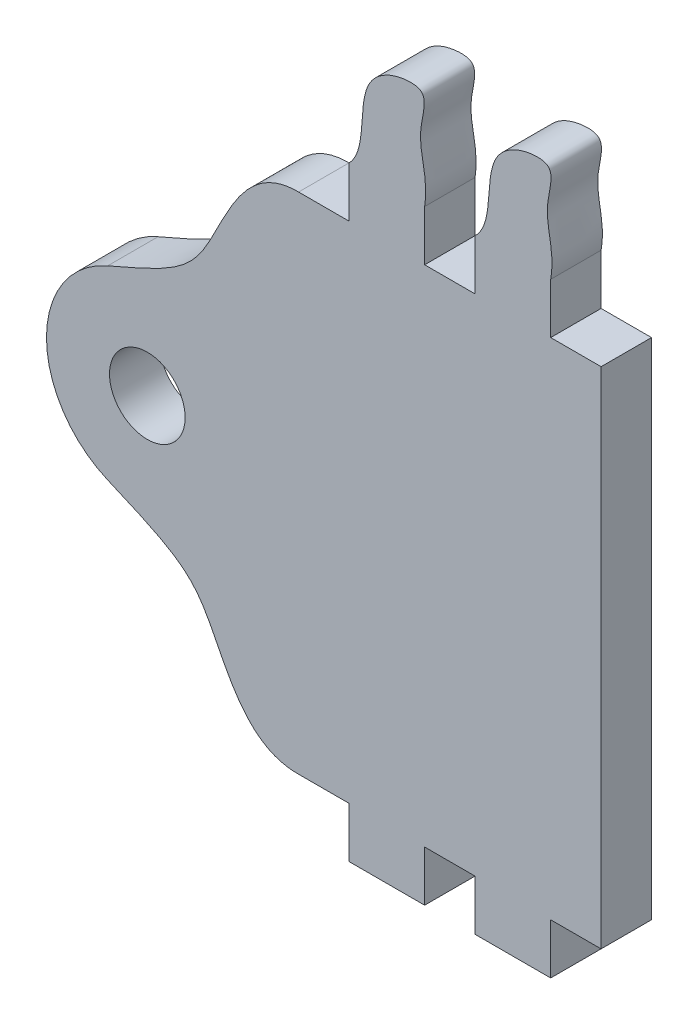
ISO-10303-21;
HEADER;
FILE_DESCRIPTION(('STEP AP214'),'2;1');
FILE_NAME('part.step','',(''),(''),'','','');
FILE_SCHEMA(('AUTOMOTIVE_DESIGN { 1 0 10303 214 1 1 1 1 }'));
ENDSEC;
DATA;
#1=APPLICATION_CONTEXT('core data for automotive mechanical design processes');
#2=APPLICATION_PROTOCOL_DEFINITION('international standard','automotive_design',2000,#1);
#3=PRODUCT_CONTEXT('',#1,'mechanical');
#4=PRODUCT('Part','Part','',(#3));
#5=PRODUCT_RELATED_PRODUCT_CATEGORY('part','',(#4));
#6=PRODUCT_DEFINITION_FORMATION('','',#4);
#7=PRODUCT_DEFINITION_CONTEXT('part definition',#1,'design');
#8=PRODUCT_DEFINITION('design','',#6,#7);
#9=PRODUCT_DEFINITION_SHAPE('','',#8);
#10=(LENGTH_UNIT() NAMED_UNIT(*) SI_UNIT(.MILLI.,.METRE.));
#11=(NAMED_UNIT(*) PLANE_ANGLE_UNIT() SI_UNIT($,.RADIAN.));
#12=(NAMED_UNIT(*) SI_UNIT($,.STERADIAN.) SOLID_ANGLE_UNIT());
#13=UNCERTAINTY_MEASURE_WITH_UNIT(LENGTH_MEASURE(1.E-05),#10,'distance_accuracy_value','');
#14=(GEOMETRIC_REPRESENTATION_CONTEXT(3) GLOBAL_UNCERTAINTY_ASSIGNED_CONTEXT((#13)) GLOBAL_UNIT_ASSIGNED_CONTEXT((#10,
#11,#12)) REPRESENTATION_CONTEXT('',''));
#15=CARTESIAN_POINT('',(0.,0.,0.));
#16=DIRECTION('',(0.,0.,1.));
#17=DIRECTION('',(1.,0.,0.));
#18=AXIS2_PLACEMENT_3D('',#15,#16,#17);
#19=CARTESIAN_POINT('',(1.5875,19.05,3.175));
#20=CARTESIAN_POINT('',(2.87606069652057,20.2829772560216,3.175));
#21=CARTESIAN_POINT('',(1.75087616831117,23.7170103339782,3.175));
#22=CARTESIAN_POINT('',(4.48010535425709,25.3439433085735,3.175));
#23=CARTESIAN_POINT('',(6.71396979884259,25.323271855298,3.175));
#24=CARTESIAN_POINT('',(5.66462971551239,22.0755663258377,3.175));
#25=CARTESIAN_POINT('',(6.66156491028358,20.8587639296577,3.175));
#26=CARTESIAN_POINT('',(6.35,19.05,3.175));
#27=B_SPLINE_CURVE_WITH_KNOTS('',3,(#19,#20,#21,#22,#23,#24,#25,#26),.UNSPECIFIED.,.F.,.F.,(4,1,
1,1,1,4),(0.,0.347503901702422,0.512635707363676,0.589513020634841,0.71223246177755,1.),.UNSPECIFIED.);
#28=DIRECTION('',(0.,0.,-1.));
#29=VECTOR('',#28,1.);
#30=SURFACE_OF_LINEAR_EXTRUSION('',#27,#29);
#31=CARTESIAN_POINT('',(1.5875,19.05,0.));
#32=CARTESIAN_POINT('',(2.87606069652057,20.2829772560216,0.));
#33=CARTESIAN_POINT('',(1.75087616831117,23.7170103339782,0.));
#34=CARTESIAN_POINT('',(4.48010535425709,25.3439433085735,0.));
#35=CARTESIAN_POINT('',(6.71396979884259,25.323271855298,0.));
#36=CARTESIAN_POINT('',(5.66462971551239,22.0755663258377,0.));
#37=CARTESIAN_POINT('',(6.66156491028358,20.8587639296577,0.));
#38=CARTESIAN_POINT('',(6.35,19.05,0.));
#39=B_SPLINE_CURVE_WITH_KNOTS('',3,(#31,#32,#33,#34,#35,#36,#37,#38),.UNSPECIFIED.,.F.,.F.,(4,1,
1,1,1,4),(0.,0.347503901702422,0.512635707363676,0.589513020634841,0.71223246177755,1.),.UNSPECIFIED.);
#40=CARTESIAN_POINT('',(1.5875,19.05,0.));
#41=VERTEX_POINT('',#40);
#42=CARTESIAN_POINT('',(6.35,19.05,0.));
#43=VERTEX_POINT('',#42);
#44=EDGE_CURVE('E355',#41,#43,#39,.T.);
#45=ORIENTED_EDGE('',*,*,#44,.F.);
#46=DIRECTION('',(0.,0.,-1.));
#47=VECTOR('',#46,1.);
#48=CARTESIAN_POINT('',(1.5875,19.05,3.175));
#49=LINE('',#48,#47);
#50=CARTESIAN_POINT('',(1.5875,19.05,3.175));
#51=VERTEX_POINT('',#50);
#52=EDGE_CURVE('E12',#51,#41,#49,.T.);
#53=ORIENTED_EDGE('',*,*,#52,.F.);
#54=CARTESIAN_POINT('',(6.35,19.05,3.175));
#55=VERTEX_POINT('',#54);
#56=EDGE_CURVE('E363',#51,#55,#27,.T.);
#57=ORIENTED_EDGE('',*,*,#56,.T.);
#58=DIRECTION('',(0.,0.,-1.));
#59=VECTOR('',#58,1.);
#60=CARTESIAN_POINT('',(6.35,19.05,3.175));
#61=LINE('',#60,#59);
#62=EDGE_CURVE('E206',#55,#43,#61,.T.);
#63=ORIENTED_EDGE('',*,*,#62,.T.);
#64=EDGE_LOOP('',(#45,#53,#57,#63));
#65=FACE_BOUND('',#64,.T.);
#66=ADVANCED_FACE('F196',(#65),#30,.T.);
#67=CARTESIAN_POINT('',(0.,0.,3.175));
#68=DIRECTION('',(0.,0.,1.));
#69=DIRECTION('',(1.,0.,0.));
#70=AXIS2_PLACEMENT_3D('',#67,#68,#69);
#71=PLANE('',#70);
#72=ORIENTED_EDGE('',*,*,#56,.F.);
#73=DIRECTION('',(0.,1.,0.));
#74=VECTOR('',#73,1.);
#75=CARTESIAN_POINT('',(1.5875,15.875,3.175));
#76=LINE('',#75,#74);
#77=CARTESIAN_POINT('',(1.5875,15.875,3.175));
#78=VERTEX_POINT('',#77);
#79=EDGE_CURVE('E349',#78,#51,#76,.T.);
#80=ORIENTED_EDGE('',*,*,#79,.F.);
#81=DIRECTION('',(-1.,0.,0.));
#82=VECTOR('',#81,1.);
#83=CARTESIAN_POINT('',(0.,15.875,3.175));
#84=LINE('',#83,#82);
#85=CARTESIAN_POINT('',(-1.5875,15.875,3.175));
#86=VERTEX_POINT('',#85);
#87=EDGE_CURVE('E360',#78,#86,#84,.T.);
#88=ORIENTED_EDGE('',*,*,#87,.T.);
#89=DIRECTION('',(0.,1.,0.));
#90=VECTOR('',#89,1.);
#91=CARTESIAN_POINT('',(-1.5875,0.,3.175));
#92=LINE('',#91,#90);
#93=CARTESIAN_POINT('',(-1.5875,19.05,3.175));
#94=VERTEX_POINT('',#93);
#95=EDGE_CURVE('E376',#86,#94,#92,.T.);
#96=ORIENTED_EDGE('',*,*,#95,.T.);
#97=CARTESIAN_POINT('',(-6.35,19.05,3.175));
#98=CARTESIAN_POINT('',(-5.10894803273728,20.3128381420379,3.175));
#99=CARTESIAN_POINT('',(-6.2487975668104,23.7826275370671,3.175));
#100=CARTESIAN_POINT('',(-3.50466824511369,25.4227491748254,3.175));
#101=CARTESIAN_POINT('',(-1.27059543399362,25.4018504855543,3.175));
#102=CARTESIAN_POINT('',(-2.33046195009797,22.1181936868102,3.175));
#103=CARTESIAN_POINT('',(-1.30296019047837,20.9022932957206,3.175));
#104=CARTESIAN_POINT('',(-1.5875,19.05,3.175));
#105=B_SPLINE_CURVE_WITH_KNOTS('',3,(#97,#98,#99,#100,#101,#102,#103,#104),.UNSPECIFIED.,.F.,
.F.,(4,1,1,1,1,4),(0.,0.348300856335532,0.511853830627675,0.58799611703179,0.709542233008579,
1.),.UNSPECIFIED.);
#106=CARTESIAN_POINT('',(-6.35,19.05,3.175));
#107=VERTEX_POINT('',#106);
#108=EDGE_CURVE('E484',#107,#94,#105,.T.);
#109=ORIENTED_EDGE('',*,*,#108,.F.);
#110=DIRECTION('',(0.,1.,0.));
#111=VECTOR('',#110,1.);
#112=CARTESIAN_POINT('',(-6.35,0.,3.175));
#113=LINE('',#112,#111);
#114=CARTESIAN_POINT('',(-6.35,15.875,3.175));
#115=VERTEX_POINT('',#114);
#116=EDGE_CURVE('E491',#115,#107,#113,.T.);
#117=ORIENTED_EDGE('',*,*,#116,.F.);
#118=CARTESIAN_POINT('',(-9.525,15.875,3.175));
#119=VERTEX_POINT('',#118);
#120=EDGE_CURVE('E374',#115,#119,#84,.T.);
#121=ORIENTED_EDGE('',*,*,#120,.T.);
#122=CARTESIAN_POINT('',(-21.5475943035882,5.83819515729678,3.175));
#123=CARTESIAN_POINT('',(-17.7413983110654,7.46649520091281,3.175));
#124=CARTESIAN_POINT('',(-15.0309393036737,8.83650062794347,3.175));
#125=CARTESIAN_POINT('',(-13.0092812161382,15.9170915840705,3.175));
#126=CARTESIAN_POINT('',(-9.525,15.875,3.175));
#127=B_SPLINE_CURVE_WITH_KNOTS('',3,(#122,#123,#124,#125,#126),.UNSPECIFIED.,.F.,.F.,(4,1,4),
(0.,0.458191309021658,1.),.UNSPECIFIED.);
#128=CARTESIAN_POINT('',(-21.5475943035882,5.83819515729678,3.175));
#129=VERTEX_POINT('',#128);
#130=EDGE_CURVE('E380',#129,#119,#127,.T.);
#131=ORIENTED_EDGE('',*,*,#130,.F.);
#132=CARTESIAN_POINT('',(-19.05,0.,3.175));
#133=DIRECTION('',(0.,0.,1.));
#134=DIRECTION('',(1.,0.,0.));
#135=AXIS2_PLACEMENT_3D('',#132,#133,#134);
#136=CIRCLE('',#135,6.35);
#137=CARTESIAN_POINT('',(-21.5475943035882,-5.83819515729678,3.175));
#138=VERTEX_POINT('',#137);
#139=EDGE_CURVE('E387',#129,#138,#136,.T.);
#140=ORIENTED_EDGE('',*,*,#139,.T.);
#141=CARTESIAN_POINT('',(-21.5475943035882,-5.83819515729679,3.175));
#142=CARTESIAN_POINT('',(-17.7413983110654,-7.46649520091282,3.175));
#143=CARTESIAN_POINT('',(-15.0309393036737,-8.83650062794347,3.175));
#144=CARTESIAN_POINT('',(-13.0092812161382,-15.9170915840705,3.175));
#145=CARTESIAN_POINT('',(-9.525,-15.875,3.175));
#146=B_SPLINE_CURVE_WITH_KNOTS('',3,(#141,#142,#143,#144,#145),.UNSPECIFIED.,.F.,.F.,(4,1,4),
(0.,0.458191309021658,1.),.UNSPECIFIED.);
#147=CARTESIAN_POINT('',(-9.525,-15.875,3.175));
#148=VERTEX_POINT('',#147);
#149=EDGE_CURVE('E564',#138,#148,#146,.T.);
#150=ORIENTED_EDGE('',*,*,#149,.T.);
#151=DIRECTION('',(-1.,0.,0.));
#152=VECTOR('',#151,1.);
#153=CARTESIAN_POINT('',(0.,-15.875,3.175));
#154=LINE('',#153,#152);
#155=CARTESIAN_POINT('',(-6.34999999999999,-15.875,3.175));
#156=VERTEX_POINT('',#155);
#157=EDGE_CURVE('E574',#156,#148,#154,.T.);
#158=ORIENTED_EDGE('',*,*,#157,.F.);
#159=DIRECTION('',(0.,-1.,0.));
#160=VECTOR('',#159,1.);
#161=CARTESIAN_POINT('',(-6.35,0.,3.175));
#162=LINE('',#161,#160);
#163=CARTESIAN_POINT('',(-6.34999999999999,-19.05,3.175));
#164=VERTEX_POINT('',#163);
#165=EDGE_CURVE('E576',#156,#164,#162,.T.);
#166=ORIENTED_EDGE('',*,*,#165,.T.);
#167=DIRECTION('',(1.,0.,0.));
#168=VECTOR('',#167,1.);
#169=CARTESIAN_POINT('',(0.,-19.05,3.175));
#170=LINE('',#169,#168);
#171=CARTESIAN_POINT('',(-1.58749999999999,-19.05,3.175));
#172=VERTEX_POINT('',#171);
#173=EDGE_CURVE('E820',#164,#172,#170,.T.);
#174=ORIENTED_EDGE('',*,*,#173,.T.);
#175=DIRECTION('',(0.,-1.,0.));
#176=VECTOR('',#175,1.);
#177=CARTESIAN_POINT('',(-1.5875,0.,3.175));
#178=LINE('',#177,#176);
#179=CARTESIAN_POINT('',(-1.58749999999999,-15.875,3.175));
#180=VERTEX_POINT('',#179);
#181=EDGE_CURVE('E823',#180,#172,#178,.T.);
#182=ORIENTED_EDGE('',*,*,#181,.F.);
#183=CARTESIAN_POINT('',(1.58750000000001,-15.875,3.175));
#184=VERTEX_POINT('',#183);
#185=EDGE_CURVE('E578',#184,#180,#154,.T.);
#186=ORIENTED_EDGE('',*,*,#185,.F.);
#187=DIRECTION('',(0.,-1.,0.));
#188=VECTOR('',#187,1.);
#189=CARTESIAN_POINT('',(1.5875,0.,3.175));
#190=LINE('',#189,#188);
#191=CARTESIAN_POINT('',(1.58750000000001,-19.05,3.175));
#192=VERTEX_POINT('',#191);
#193=EDGE_CURVE('E827',#184,#192,#190,.T.);
#194=ORIENTED_EDGE('',*,*,#193,.T.);
#195=DIRECTION('',(1.,0.,0.));
#196=VECTOR('',#195,1.);
#197=CARTESIAN_POINT('',(0.,-19.05,3.175));
#198=LINE('',#197,#196);
#199=CARTESIAN_POINT('',(6.35000000000001,-19.05,3.175));
#200=VERTEX_POINT('',#199);
#201=EDGE_CURVE('E829',#192,#200,#198,.T.);
#202=ORIENTED_EDGE('',*,*,#201,.T.);
#203=DIRECTION('',(0.,-1.,0.));
#204=VECTOR('',#203,1.);
#205=CARTESIAN_POINT('',(6.35,0.,3.175));
#206=LINE('',#205,#204);
#207=CARTESIAN_POINT('',(6.35000000000001,-15.875,3.175));
#208=VERTEX_POINT('',#207);
#209=EDGE_CURVE('E831',#208,#200,#206,.T.);
#210=ORIENTED_EDGE('',*,*,#209,.F.);
#211=CARTESIAN_POINT('',(9.525,-15.875,3.175));
#212=VERTEX_POINT('',#211);
#213=EDGE_CURVE('E377',#212,#208,#154,.T.);
#214=ORIENTED_EDGE('',*,*,#213,.F.);
#215=DIRECTION('',(0.,1.,0.));
#216=VECTOR('',#215,1.);
#217=CARTESIAN_POINT('',(9.525,0.,3.175));
#218=LINE('',#217,#216);
#219=CARTESIAN_POINT('',(9.525,15.875,3.175));
#220=VERTEX_POINT('',#219);
#221=EDGE_CURVE('E372',#212,#220,#218,.T.);
#222=ORIENTED_EDGE('',*,*,#221,.T.);
#223=CARTESIAN_POINT('',(6.35,15.875,3.175));
#224=VERTEX_POINT('',#223);
#225=EDGE_CURVE('E371',#220,#224,#84,.T.);
#226=ORIENTED_EDGE('',*,*,#225,.T.);
#227=DIRECTION('',(0.,1.,0.));
#228=VECTOR('',#227,1.);
#229=CARTESIAN_POINT('',(6.35,15.875,3.175));
#230=LINE('',#229,#228);
#231=EDGE_CURVE('E365',#224,#55,#230,.T.);
#232=ORIENTED_EDGE('',*,*,#231,.T.);
#233=EDGE_LOOP('',(#72,#80,#88,#96,#109,#117,#121,#131,#140,#150,#158,#166,#174,#182,#186,#194,
#202,#210,#214,#222,#226,#232));
#234=FACE_BOUND('',#233,.T.);
#235=CARTESIAN_POINT('',(-19.05,0.,3.175));
#236=DIRECTION('',(0.,0.,1.));
#237=DIRECTION('',(1.,0.,0.));
#238=AXIS2_PLACEMENT_3D('',#235,#236,#237);
#239=CIRCLE('',#238,2.38125);
#240=CARTESIAN_POINT('',(-16.66875,0.,3.175));
#241=VERTEX_POINT('',#240);
#242=EDGE_CURVE('E401',#241,#241,#239,.T.);
#243=ORIENTED_EDGE('',*,*,#242,.F.);
#244=EDGE_LOOP('',(#243));
#245=FACE_BOUND('',#244,.T.);
#246=ADVANCED_FACE('F358',(#234,#245),#71,.T.);
#247=CARTESIAN_POINT('',(0.,0.,0.));
#248=DIRECTION('',(0.,0.,1.));
#249=DIRECTION('',(1.,0.,0.));
#250=AXIS2_PLACEMENT_3D('',#247,#248,#249);
#251=PLANE('',#250);
#252=ORIENTED_EDGE('',*,*,#44,.T.);
#253=DIRECTION('',(0.,1.,0.));
#254=VECTOR('',#253,1.);
#255=CARTESIAN_POINT('',(6.35,15.875,0.));
#256=LINE('',#255,#254);
#257=CARTESIAN_POINT('',(6.35,15.875,0.));
#258=VERTEX_POINT('',#257);
#259=EDGE_CURVE('E439',#258,#43,#256,.T.);
#260=ORIENTED_EDGE('',*,*,#259,.F.);
#261=DIRECTION('',(-1.,0.,0.));
#262=VECTOR('',#261,1.);
#263=CARTESIAN_POINT('',(0.,15.875,0.));
#264=LINE('',#263,#262);
#265=CARTESIAN_POINT('',(9.525,15.875,0.));
#266=VERTEX_POINT('',#265);
#267=EDGE_CURVE('E502',#266,#258,#264,.T.);
#268=ORIENTED_EDGE('',*,*,#267,.F.);
#269=DIRECTION('',(0.,1.,0.));
#270=VECTOR('',#269,1.);
#271=CARTESIAN_POINT('',(9.525,0.,0.));
#272=LINE('',#271,#270);
#273=CARTESIAN_POINT('',(9.525,-15.875,0.));
#274=VERTEX_POINT('',#273);
#275=EDGE_CURVE('E541',#274,#266,#272,.T.);
#276=ORIENTED_EDGE('',*,*,#275,.F.);
#277=DIRECTION('',(-1.,0.,0.));
#278=VECTOR('',#277,1.);
#279=CARTESIAN_POINT('',(0.,-15.875,0.));
#280=LINE('',#279,#278);
#281=CARTESIAN_POINT('',(6.35000000000001,-15.875,0.));
#282=VERTEX_POINT('',#281);
#283=EDGE_CURVE('E524',#274,#282,#280,.T.);
#284=ORIENTED_EDGE('',*,*,#283,.T.);
#285=DIRECTION('',(0.,-1.,0.));
#286=VECTOR('',#285,1.);
#287=CARTESIAN_POINT('',(6.35,0.,0.));
#288=LINE('',#287,#286);
#289=CARTESIAN_POINT('',(6.35000000000001,-19.05,0.));
#290=VERTEX_POINT('',#289);
#291=EDGE_CURVE('E538',#282,#290,#288,.T.);
#292=ORIENTED_EDGE('',*,*,#291,.T.);
#293=DIRECTION('',(1.,0.,0.));
#294=VECTOR('',#293,1.);
#295=CARTESIAN_POINT('',(0.,-19.05,0.));
#296=LINE('',#295,#294);
#297=CARTESIAN_POINT('',(1.58750000000001,-19.05,0.));
#298=VERTEX_POINT('',#297);
#299=EDGE_CURVE('E535',#298,#290,#296,.T.);
#300=ORIENTED_EDGE('',*,*,#299,.F.);
#301=DIRECTION('',(0.,-1.,0.));
#302=VECTOR('',#301,1.);
#303=CARTESIAN_POINT('',(1.5875,0.,0.));
#304=LINE('',#303,#302);
#305=CARTESIAN_POINT('',(1.58750000000001,-15.875,0.));
#306=VERTEX_POINT('',#305);
#307=EDGE_CURVE('E533',#306,#298,#304,.T.);
#308=ORIENTED_EDGE('',*,*,#307,.F.);
#309=CARTESIAN_POINT('',(-1.58749999999999,-15.875,0.));
#310=VERTEX_POINT('',#309);
#311=EDGE_CURVE('E525',#306,#310,#280,.T.);
#312=ORIENTED_EDGE('',*,*,#311,.T.);
#313=DIRECTION('',(0.,-1.,0.));
#314=VECTOR('',#313,1.);
#315=CARTESIAN_POINT('',(-1.5875,0.,0.));
#316=LINE('',#315,#314);
#317=CARTESIAN_POINT('',(-1.58749999999999,-19.05,0.));
#318=VERTEX_POINT('',#317);
#319=EDGE_CURVE('E530',#310,#318,#316,.T.);
#320=ORIENTED_EDGE('',*,*,#319,.T.);
#321=DIRECTION('',(1.,0.,0.));
#322=VECTOR('',#321,1.);
#323=CARTESIAN_POINT('',(0.,-19.05,0.));
#324=LINE('',#323,#322);
#325=CARTESIAN_POINT('',(-6.34999999999999,-19.05,0.));
#326=VERTEX_POINT('',#325);
#327=EDGE_CURVE('E527',#326,#318,#324,.T.);
#328=ORIENTED_EDGE('',*,*,#327,.F.);
#329=DIRECTION('',(0.,-1.,0.));
#330=VECTOR('',#329,1.);
#331=CARTESIAN_POINT('',(-6.35,0.,0.));
#332=LINE('',#331,#330);
#333=CARTESIAN_POINT('',(-6.34999999999999,-15.875,0.));
#334=VERTEX_POINT('',#333);
#335=EDGE_CURVE('E523',#334,#326,#332,.T.);
#336=ORIENTED_EDGE('',*,*,#335,.F.);
#337=CARTESIAN_POINT('',(-9.525,-15.875,0.));
#338=VERTEX_POINT('',#337);
#339=EDGE_CURVE('E517',#334,#338,#280,.T.);
#340=ORIENTED_EDGE('',*,*,#339,.T.);
#341=CARTESIAN_POINT('',(-21.5475943035882,-5.83819515729679,0.));
#342=CARTESIAN_POINT('',(-17.7413983110654,-7.46649520091282,0.));
#343=CARTESIAN_POINT('',(-15.0309393036737,-8.83650062794347,0.));
#344=CARTESIAN_POINT('',(-13.0092812161382,-15.9170915840705,0.));
#345=CARTESIAN_POINT('',(-9.525,-15.875,0.));
#346=B_SPLINE_CURVE_WITH_KNOTS('',3,(#341,#342,#343,#344,#345),.UNSPECIFIED.,.F.,.F.,(4,1,4),
(0.,0.458191309021658,1.),.UNSPECIFIED.);
#347=CARTESIAN_POINT('',(-21.5475943035882,-5.83819515729678,0.));
#348=VERTEX_POINT('',#347);
#349=EDGE_CURVE('E512',#348,#338,#346,.T.);
#350=ORIENTED_EDGE('',*,*,#349,.F.);
#351=CARTESIAN_POINT('',(-19.05,0.,0.));
#352=DIRECTION('',(0.,0.,1.));
#353=DIRECTION('',(1.,0.,0.));
#354=AXIS2_PLACEMENT_3D('',#351,#352,#353);
#355=CIRCLE('',#354,6.35);
#356=CARTESIAN_POINT('',(-21.5475943035882,5.83819515729678,0.));
#357=VERTEX_POINT('',#356);
#358=EDGE_CURVE('E507',#357,#348,#355,.T.);
#359=ORIENTED_EDGE('',*,*,#358,.F.);
#360=CARTESIAN_POINT('',(-21.5475943035882,5.83819515729678,0.));
#361=CARTESIAN_POINT('',(-17.7413983110654,7.46649520091281,0.));
#362=CARTESIAN_POINT('',(-15.0309393036737,8.83650062794347,0.));
#363=CARTESIAN_POINT('',(-13.0092812161382,15.9170915840705,0.));
#364=CARTESIAN_POINT('',(-9.525,15.875,0.));
#365=B_SPLINE_CURVE_WITH_KNOTS('',3,(#360,#361,#362,#363,#364),.UNSPECIFIED.,.F.,.F.,(4,1,4),
(0.,0.458191309021658,1.),.UNSPECIFIED.);
#366=CARTESIAN_POINT('',(-9.525,15.875,0.));
#367=VERTEX_POINT('',#366);
#368=EDGE_CURVE('E501',#357,#367,#365,.T.);
#369=ORIENTED_EDGE('',*,*,#368,.T.);
#370=CARTESIAN_POINT('',(-6.35,15.875,0.));
#371=VERTEX_POINT('',#370);
#372=EDGE_CURVE('E364',#371,#367,#264,.T.);
#373=ORIENTED_EDGE('',*,*,#372,.F.);
#374=DIRECTION('',(0.,1.,0.));
#375=VECTOR('',#374,1.);
#376=CARTESIAN_POINT('',(-6.35,0.,0.));
#377=LINE('',#376,#375);
#378=CARTESIAN_POINT('',(-6.35,19.05,0.));
#379=VERTEX_POINT('',#378);
#380=EDGE_CURVE('E389',#371,#379,#377,.T.);
#381=ORIENTED_EDGE('',*,*,#380,.T.);
#382=CARTESIAN_POINT('',(-6.35,19.05,0.));
#383=CARTESIAN_POINT('',(-5.10894803273728,20.3128381420379,0.));
#384=CARTESIAN_POINT('',(-6.2487975668104,23.7826275370671,0.));
#385=CARTESIAN_POINT('',(-3.50466824511369,25.4227491748254,0.));
#386=CARTESIAN_POINT('',(-1.27059543399362,25.4018504855543,0.));
#387=CARTESIAN_POINT('',(-2.33046195009797,22.1181936868102,0.));
#388=CARTESIAN_POINT('',(-1.30296019047837,20.9022932957206,0.));
#389=CARTESIAN_POINT('',(-1.5875,19.05,0.));
#390=B_SPLINE_CURVE_WITH_KNOTS('',3,(#382,#383,#384,#385,#386,#387,#388,#389),.UNSPECIFIED.,.F.,
.F.,(4,1,1,1,1,4),(0.,0.348300856335532,0.511853830627675,0.58799611703179,0.709542233008579,
1.),.UNSPECIFIED.);
#391=CARTESIAN_POINT('',(-1.5875,19.05,0.));
#392=VERTEX_POINT('',#391);
#393=EDGE_CURVE('E394',#379,#392,#390,.T.);
#394=ORIENTED_EDGE('',*,*,#393,.T.);
#395=DIRECTION('',(0.,1.,0.));
#396=VECTOR('',#395,1.);
#397=CARTESIAN_POINT('',(-1.5875,0.,0.));
#398=LINE('',#397,#396);
#399=CARTESIAN_POINT('',(-1.5875,15.875,0.));
#400=VERTEX_POINT('',#399);
#401=EDGE_CURVE('E543',#400,#392,#398,.T.);
#402=ORIENTED_EDGE('',*,*,#401,.F.);
#403=CARTESIAN_POINT('',(1.5875,15.875,0.));
#404=VERTEX_POINT('',#403);
#405=EDGE_CURVE('E446',#404,#400,#264,.T.);
#406=ORIENTED_EDGE('',*,*,#405,.F.);
#407=DIRECTION('',(0.,1.,0.));
#408=VECTOR('',#407,1.);
#409=CARTESIAN_POINT('',(1.5875,15.875,0.));
#410=LINE('',#409,#408);
#411=EDGE_CURVE('E200',#404,#41,#410,.T.);
#412=ORIENTED_EDGE('',*,*,#411,.T.);
#413=EDGE_LOOP('',(#252,#260,#268,#276,#284,#292,#300,#308,#312,#320,#328,#336,#340,#350,#359,
#369,#373,#381,#394,#402,#406,#412));
#414=FACE_BOUND('',#413,.T.);
#415=CARTESIAN_POINT('',(-19.05,0.,0.));
#416=DIRECTION('',(0.,0.,1.));
#417=DIRECTION('',(1.,0.,0.));
#418=AXIS2_PLACEMENT_3D('',#415,#416,#417);
#419=CIRCLE('',#418,2.38125);
#420=CARTESIAN_POINT('',(-16.66875,0.,0.));
#421=VERTEX_POINT('',#420);
#422=EDGE_CURVE('E381',#421,#421,#419,.T.);
#423=ORIENTED_EDGE('',*,*,#422,.T.);
#424=EDGE_LOOP('',(#423));
#425=FACE_BOUND('',#424,.T.);
#426=ADVANCED_FACE('F444',(#414,#425),#251,.F.);
#427=CARTESIAN_POINT('',(-19.05,0.,3.175));
#428=DIRECTION('',(0.,0.,-1.));
#429=DIRECTION('',(-1.,0.,0.));
#430=AXIS2_PLACEMENT_3D('',#427,#428,#429);
#431=CYLINDRICAL_SURFACE('',#430,2.38125);
#432=ORIENTED_EDGE('',*,*,#242,.T.);
#433=EDGE_LOOP('',(#432));
#434=FACE_BOUND('',#433,.T.);
#435=ORIENTED_EDGE('',*,*,#422,.F.);
#436=EDGE_LOOP('',(#435));
#437=FACE_BOUND('',#436,.T.);
#438=ADVANCED_FACE('F466',(#434,#437),#431,.F.);
#439=DIRECTION('',(0.,0.,-1.));
#440=VECTOR('',#439,1.);
#441=SURFACE_OF_LINEAR_EXTRUSION('',#127,#440);
#442=ORIENTED_EDGE('',*,*,#368,.F.);
#443=DIRECTION('',(0.,0.,-1.));
#444=VECTOR('',#443,1.);
#445=CARTESIAN_POINT('',(-21.5475943035882,5.83819515729678,3.175));
#446=LINE('',#445,#444);
#447=EDGE_CURVE('E434',#129,#357,#446,.T.);
#448=ORIENTED_EDGE('',*,*,#447,.F.);
#449=ORIENTED_EDGE('',*,*,#130,.T.);
#450=DIRECTION('',(0.,0.,-1.));
#451=VECTOR('',#450,1.);
#452=CARTESIAN_POINT('',(-9.525,15.875,3.175));
#453=LINE('',#452,#451);
#454=EDGE_CURVE('E436',#119,#367,#453,.T.);
#455=ORIENTED_EDGE('',*,*,#454,.T.);
#456=EDGE_LOOP('',(#442,#448,#449,#455));
#457=FACE_BOUND('',#456,.T.);
#458=ADVANCED_FACE('F470',(#457),#441,.T.);
#459=CARTESIAN_POINT('',(-19.05,0.,3.175));
#460=DIRECTION('',(0.,0.,-1.));
#461=DIRECTION('',(-1.,0.,0.));
#462=AXIS2_PLACEMENT_3D('',#459,#460,#461);
#463=CYLINDRICAL_SURFACE('',#462,6.35);
#464=ORIENTED_EDGE('',*,*,#358,.T.);
#465=DIRECTION('',(0.,0.,-1.));
#466=VECTOR('',#465,1.);
#467=CARTESIAN_POINT('',(-21.5475943035882,-5.83819515729678,3.175));
#468=LINE('',#467,#466);
#469=EDGE_CURVE('E431',#138,#348,#468,.T.);
#470=ORIENTED_EDGE('',*,*,#469,.F.);
#471=ORIENTED_EDGE('',*,*,#139,.F.);
#472=ORIENTED_EDGE('',*,*,#447,.T.);
#473=EDGE_LOOP('',(#464,#470,#471,#472));
#474=FACE_BOUND('',#473,.T.);
#475=ADVANCED_FACE('F568',(#474),#463,.T.);
#476=DIRECTION('',(0.,0.,-1.));
#477=VECTOR('',#476,1.);
#478=SURFACE_OF_LINEAR_EXTRUSION('',#146,#477);
#479=ORIENTED_EDGE('',*,*,#349,.T.);
#480=DIRECTION('',(0.,0.,-1.));
#481=VECTOR('',#480,1.);
#482=CARTESIAN_POINT('',(-9.525,-15.875,3.175));
#483=LINE('',#482,#481);
#484=EDGE_CURVE('E429',#148,#338,#483,.T.);
#485=ORIENTED_EDGE('',*,*,#484,.F.);
#486=ORIENTED_EDGE('',*,*,#149,.F.);
#487=ORIENTED_EDGE('',*,*,#469,.T.);
#488=EDGE_LOOP('',(#479,#485,#486,#487));
#489=FACE_BOUND('',#488,.T.);
#490=ADVANCED_FACE('F572',(#489),#478,.F.);
#491=CARTESIAN_POINT('',(0.,-15.875,3.175));
#492=DIRECTION('',(0.,-1.,0.));
#493=DIRECTION('',(0.,0.,-1.));
#494=AXIS2_PLACEMENT_3D('',#491,#492,#493);
#495=PLANE('',#494);
#496=ORIENTED_EDGE('',*,*,#339,.F.);
#497=DIRECTION('',(0.,0.,-1.));
#498=VECTOR('',#497,1.);
#499=CARTESIAN_POINT('',(-6.34999999999999,-15.875,3.175));
#500=LINE('',#499,#498);
#501=EDGE_CURVE('E427',#156,#334,#500,.T.);
#502=ORIENTED_EDGE('',*,*,#501,.F.);
#503=ORIENTED_EDGE('',*,*,#157,.T.);
#504=ORIENTED_EDGE('',*,*,#484,.T.);
#505=EDGE_LOOP('',(#496,#502,#503,#504));
#506=FACE_BOUND('',#505,.T.);
#507=ADVANCED_FACE('F590',(#506),#495,.T.);
#508=CARTESIAN_POINT('',(-6.35,0.,3.175));
#509=DIRECTION('',(1.,0.,0.));
#510=DIRECTION('',(0.,1.,0.));
#511=AXIS2_PLACEMENT_3D('',#508,#509,#510);
#512=PLANE('',#511);
#513=ORIENTED_EDGE('',*,*,#335,.T.);
#514=DIRECTION('',(0.,0.,-1.));
#515=VECTOR('',#514,1.);
#516=CARTESIAN_POINT('',(-6.34999999999999,-19.05,3.175));
#517=LINE('',#516,#515);
#518=EDGE_CURVE('E424',#164,#326,#517,.T.);
#519=ORIENTED_EDGE('',*,*,#518,.F.);
#520=ORIENTED_EDGE('',*,*,#165,.F.);
#521=ORIENTED_EDGE('',*,*,#501,.T.);
#522=EDGE_LOOP('',(#513,#519,#520,#521));
#523=FACE_BOUND('',#522,.T.);
#524=ADVANCED_FACE('F591',(#523),#512,.F.);
#525=CARTESIAN_POINT('',(0.,-19.05,3.175));
#526=DIRECTION('',(0.,1.,0.));
#527=DIRECTION('',(0.,0.,1.));
#528=AXIS2_PLACEMENT_3D('',#525,#526,#527);
#529=PLANE('',#528);
#530=ORIENTED_EDGE('',*,*,#327,.T.);
#531=DIRECTION('',(0.,0.,-1.));
#532=VECTOR('',#531,1.);
#533=CARTESIAN_POINT('',(-1.58749999999999,-19.05,3.175));
#534=LINE('',#533,#532);
#535=EDGE_CURVE('E422',#172,#318,#534,.T.);
#536=ORIENTED_EDGE('',*,*,#535,.F.);
#537=ORIENTED_EDGE('',*,*,#173,.F.);
#538=ORIENTED_EDGE('',*,*,#518,.T.);
#539=EDGE_LOOP('',(#530,#536,#537,#538));
#540=FACE_BOUND('',#539,.T.);
#541=ADVANCED_FACE('F733',(#540),#529,.F.);
#542=CARTESIAN_POINT('',(-1.5875,0.,3.175));
#543=DIRECTION('',(1.,0.,0.));
#544=DIRECTION('',(0.,1.,0.));
#545=AXIS2_PLACEMENT_3D('',#542,#543,#544);
#546=PLANE('',#545);
#547=ORIENTED_EDGE('',*,*,#319,.F.);
#548=DIRECTION('',(0.,0.,-1.));
#549=VECTOR('',#548,1.);
#550=CARTESIAN_POINT('',(-1.58749999999999,-15.875,3.175));
#551=LINE('',#550,#549);
#552=EDGE_CURVE('E420',#180,#310,#551,.T.);
#553=ORIENTED_EDGE('',*,*,#552,.F.);
#554=ORIENTED_EDGE('',*,*,#181,.T.);
#555=ORIENTED_EDGE('',*,*,#535,.T.);
#556=EDGE_LOOP('',(#547,#553,#554,#555));
#557=FACE_BOUND('',#556,.T.);
#558=ADVANCED_FACE('F725',(#557),#546,.T.);
#559=ORIENTED_EDGE('',*,*,#311,.F.);
#560=DIRECTION('',(0.,0.,-1.));
#561=VECTOR('',#560,1.);
#562=CARTESIAN_POINT('',(1.58750000000001,-15.875,3.175));
#563=LINE('',#562,#561);
#564=EDGE_CURVE('E418',#184,#306,#563,.T.);
#565=ORIENTED_EDGE('',*,*,#564,.F.);
#566=ORIENTED_EDGE('',*,*,#185,.T.);
#567=ORIENTED_EDGE('',*,*,#552,.T.);
#568=EDGE_LOOP('',(#559,#565,#566,#567));
#569=FACE_BOUND('',#568,.T.);
#570=ADVANCED_FACE('F692',(#569),#495,.T.);
#571=CARTESIAN_POINT('',(1.5875,0.,3.175));
#572=DIRECTION('',(1.,0.,0.));
#573=DIRECTION('',(0.,1.,0.));
#574=AXIS2_PLACEMENT_3D('',#571,#572,#573);
#575=PLANE('',#574);
#576=ORIENTED_EDGE('',*,*,#307,.T.);
#577=DIRECTION('',(0.,0.,-1.));
#578=VECTOR('',#577,1.);
#579=CARTESIAN_POINT('',(1.58750000000001,-19.05,3.175));
#580=LINE('',#579,#578);
#581=EDGE_CURVE('E415',#192,#298,#580,.T.);
#582=ORIENTED_EDGE('',*,*,#581,.F.);
#583=ORIENTED_EDGE('',*,*,#193,.F.);
#584=ORIENTED_EDGE('',*,*,#564,.T.);
#585=EDGE_LOOP('',(#576,#582,#583,#584));
#586=FACE_BOUND('',#585,.T.);
#587=ADVANCED_FACE('F708',(#586),#575,.F.);
#588=CARTESIAN_POINT('',(0.,-19.05,3.175));
#589=DIRECTION('',(0.,1.,0.));
#590=DIRECTION('',(0.,0.,1.));
#591=AXIS2_PLACEMENT_3D('',#588,#589,#590);
#592=PLANE('',#591);
#593=ORIENTED_EDGE('',*,*,#299,.T.);
#594=DIRECTION('',(0.,0.,-1.));
#595=VECTOR('',#594,1.);
#596=CARTESIAN_POINT('',(6.35000000000001,-19.05,3.175));
#597=LINE('',#596,#595);
#598=EDGE_CURVE('E413',#200,#290,#597,.T.);
#599=ORIENTED_EDGE('',*,*,#598,.F.);
#600=ORIENTED_EDGE('',*,*,#201,.F.);
#601=ORIENTED_EDGE('',*,*,#581,.T.);
#602=EDGE_LOOP('',(#593,#599,#600,#601));
#603=FACE_BOUND('',#602,.T.);
#604=ADVANCED_FACE('F699',(#603),#592,.F.);
#605=CARTESIAN_POINT('',(6.35,0.,3.175));
#606=DIRECTION('',(1.,0.,0.));
#607=DIRECTION('',(0.,1.,0.));
#608=AXIS2_PLACEMENT_3D('',#605,#606,#607);
#609=PLANE('',#608);
#610=ORIENTED_EDGE('',*,*,#291,.F.);
#611=DIRECTION('',(0.,0.,-1.));
#612=VECTOR('',#611,1.);
#613=CARTESIAN_POINT('',(6.35000000000001,-15.875,3.175));
#614=LINE('',#613,#612);
#615=EDGE_CURVE('E411',#208,#282,#614,.T.);
#616=ORIENTED_EDGE('',*,*,#615,.F.);
#617=ORIENTED_EDGE('',*,*,#209,.T.);
#618=ORIENTED_EDGE('',*,*,#598,.T.);
#619=EDGE_LOOP('',(#610,#616,#617,#618));
#620=FACE_BOUND('',#619,.T.);
#621=ADVANCED_FACE('F689',(#620),#609,.T.);
#622=ORIENTED_EDGE('',*,*,#283,.F.);
#623=DIRECTION('',(0.,0.,-1.));
#624=VECTOR('',#623,1.);
#625=CARTESIAN_POINT('',(9.525,-15.875,3.175));
#626=LINE('',#625,#624);
#627=EDGE_CURVE('E409',#212,#274,#626,.T.);
#628=ORIENTED_EDGE('',*,*,#627,.F.);
#629=ORIENTED_EDGE('',*,*,#213,.T.);
#630=ORIENTED_EDGE('',*,*,#615,.T.);
#631=EDGE_LOOP('',(#622,#628,#629,#630));
#632=FACE_BOUND('',#631,.T.);
#633=ADVANCED_FACE('F681',(#632),#495,.T.);
#634=CARTESIAN_POINT('',(9.525,0.,3.175));
#635=DIRECTION('',(-1.,0.,0.));
#636=DIRECTION('',(0.,-1.,0.));
#637=AXIS2_PLACEMENT_3D('',#634,#635,#636);
#638=PLANE('',#637);
#639=ORIENTED_EDGE('',*,*,#275,.T.);
#640=DIRECTION('',(0.,0.,-1.));
#641=VECTOR('',#640,1.);
#642=CARTESIAN_POINT('',(9.525,15.875,3.175));
#643=LINE('',#642,#641);
#644=EDGE_CURVE('E406',#220,#266,#643,.T.);
#645=ORIENTED_EDGE('',*,*,#644,.F.);
#646=ORIENTED_EDGE('',*,*,#221,.F.);
#647=ORIENTED_EDGE('',*,*,#627,.T.);
#648=EDGE_LOOP('',(#639,#645,#646,#647));
#649=FACE_BOUND('',#648,.T.);
#650=ADVANCED_FACE('F611',(#649),#638,.F.);
#651=CARTESIAN_POINT('',(-1.5875,0.,3.175));
#652=DIRECTION('',(-1.,0.,0.));
#653=DIRECTION('',(0.,0.,1.));
#654=AXIS2_PLACEMENT_3D('',#651,#652,#653);
#655=PLANE('',#654);
#656=ORIENTED_EDGE('',*,*,#401,.T.);
#657=DIRECTION('',(0.,0.,-1.));
#658=VECTOR('',#657,1.);
#659=CARTESIAN_POINT('',(-1.5875,19.05,3.175));
#660=LINE('',#659,#658);
#661=EDGE_CURVE('E403',#94,#392,#660,.T.);
#662=ORIENTED_EDGE('',*,*,#661,.F.);
#663=ORIENTED_EDGE('',*,*,#95,.F.);
#664=DIRECTION('',(0.,0.,-1.));
#665=VECTOR('',#664,1.);
#666=CARTESIAN_POINT('',(-1.5875,15.875,3.175));
#667=LINE('',#666,#665);
#668=EDGE_CURVE('E369',#86,#400,#667,.T.);
#669=ORIENTED_EDGE('',*,*,#668,.T.);
#670=EDGE_LOOP('',(#656,#662,#663,#669));
#671=FACE_BOUND('',#670,.T.);
#672=ADVANCED_FACE('F481',(#671),#655,.F.);
#673=DIRECTION('',(0.,0.,-1.));
#674=VECTOR('',#673,1.);
#675=SURFACE_OF_LINEAR_EXTRUSION('',#105,#674);
#676=ORIENTED_EDGE('',*,*,#393,.F.);
#677=DIRECTION('',(0.,0.,-1.));
#678=VECTOR('',#677,1.);
#679=CARTESIAN_POINT('',(-6.35,19.05,3.175));
#680=LINE('',#679,#678);
#681=EDGE_CURVE('E400',#107,#379,#680,.T.);
#682=ORIENTED_EDGE('',*,*,#681,.F.);
#683=ORIENTED_EDGE('',*,*,#108,.T.);
#684=ORIENTED_EDGE('',*,*,#661,.T.);
#685=EDGE_LOOP('',(#676,#682,#683,#684));
#686=FACE_BOUND('',#685,.T.);
#687=ADVANCED_FACE('F476',(#686),#675,.T.);
#688=CARTESIAN_POINT('',(-6.35,0.,3.175));
#689=DIRECTION('',(-1.,0.,0.));
#690=DIRECTION('',(0.,0.,1.));
#691=AXIS2_PLACEMENT_3D('',#688,#689,#690);
#692=PLANE('',#691);
#693=ORIENTED_EDGE('',*,*,#380,.F.);
#694=DIRECTION('',(0.,0.,-1.));
#695=VECTOR('',#694,1.);
#696=CARTESIAN_POINT('',(-6.35,15.875,3.175));
#697=LINE('',#696,#695);
#698=EDGE_CURVE('E398',#115,#371,#697,.T.);
#699=ORIENTED_EDGE('',*,*,#698,.F.);
#700=ORIENTED_EDGE('',*,*,#116,.T.);
#701=ORIENTED_EDGE('',*,*,#681,.T.);
#702=EDGE_LOOP('',(#693,#699,#700,#701));
#703=FACE_BOUND('',#702,.T.);
#704=ADVANCED_FACE('F472',(#703),#692,.T.);
#705=CARTESIAN_POINT('',(0.,15.875,3.175));
#706=DIRECTION('',(0.,-1.,0.));
#707=DIRECTION('',(0.,0.,-1.));
#708=AXIS2_PLACEMENT_3D('',#705,#706,#707);
#709=PLANE('',#708);
#710=ORIENTED_EDGE('',*,*,#372,.T.);
#711=ORIENTED_EDGE('',*,*,#454,.F.);
#712=ORIENTED_EDGE('',*,*,#120,.F.);
#713=ORIENTED_EDGE('',*,*,#698,.T.);
#714=EDGE_LOOP('',(#710,#711,#712,#713));
#715=FACE_BOUND('',#714,.T.);
#716=ADVANCED_FACE('F475',(#715),#709,.F.);
#717=ORIENTED_EDGE('',*,*,#87,.F.);
#718=DIRECTION('',(0.,0.,-1.));
#719=VECTOR('',#718,1.);
#720=CARTESIAN_POINT('',(1.5875,15.875,3.175));
#721=LINE('',#720,#719);
#722=EDGE_CURVE('E346',#78,#404,#721,.T.);
#723=ORIENTED_EDGE('',*,*,#722,.T.);
#724=ORIENTED_EDGE('',*,*,#405,.T.);
#725=ORIENTED_EDGE('',*,*,#668,.F.);
#726=EDGE_LOOP('',(#717,#723,#724,#725));
#727=FACE_BOUND('',#726,.T.);
#728=ADVANCED_FACE('F367',(#727),#709,.F.);
#729=DIRECTION('',(0.,0.,-1.));
#730=VECTOR('',#729,1.);
#731=CARTESIAN_POINT('',(6.35,15.875,3.175));
#732=LINE('',#731,#730);
#733=EDGE_CURVE('E341',#224,#258,#732,.T.);
#734=ORIENTED_EDGE('',*,*,#733,.F.);
#735=ORIENTED_EDGE('',*,*,#225,.F.);
#736=ORIENTED_EDGE('',*,*,#644,.T.);
#737=ORIENTED_EDGE('',*,*,#267,.T.);
#738=EDGE_LOOP('',(#734,#735,#736,#737));
#739=FACE_BOUND('',#738,.T.);
#740=ADVANCED_FACE('F603',(#739),#709,.F.);
#741=CARTESIAN_POINT('',(1.5875,15.875,3.175));
#742=DIRECTION('',(-1.,0.,0.));
#743=DIRECTION('',(0.,-1.,0.));
#744=AXIS2_PLACEMENT_3D('',#741,#742,#743);
#745=PLANE('',#744);
#746=ORIENTED_EDGE('',*,*,#411,.F.);
#747=ORIENTED_EDGE('',*,*,#722,.F.);
#748=ORIENTED_EDGE('',*,*,#79,.T.);
#749=ORIENTED_EDGE('',*,*,#52,.T.);
#750=EDGE_LOOP('',(#746,#747,#748,#749));
#751=FACE_BOUND('',#750,.T.);
#752=ADVANCED_FACE('F348',(#751),#745,.T.);
#753=CARTESIAN_POINT('',(6.35,15.875,3.175));
#754=DIRECTION('',(-1.,0.,0.));
#755=DIRECTION('',(0.,0.,1.));
#756=AXIS2_PLACEMENT_3D('',#753,#754,#755);
#757=PLANE('',#756);
#758=ORIENTED_EDGE('',*,*,#259,.T.);
#759=ORIENTED_EDGE('',*,*,#62,.F.);
#760=ORIENTED_EDGE('',*,*,#231,.F.);
#761=ORIENTED_EDGE('',*,*,#733,.T.);
#762=EDGE_LOOP('',(#758,#759,#760,#761));
#763=FACE_BOUND('',#762,.T.);
#764=ADVANCED_FACE('F198',(#763),#757,.F.);
#765=CLOSED_SHELL('',(#66,#246,#426,#438,#458,#475,#490,#507,#524,#541,#558,#570,#587,#604,#621,
#633,#650,#672,#687,#704,#716,#728,#740,#752,#764));
#766=MANIFOLD_SOLID_BREP('B2',#765);
#767=ADVANCED_BREP_SHAPE_REPRESENTATION('',(#18,#766),#14);
#768=SHAPE_DEFINITION_REPRESENTATION(#9,#767);
ENDSEC;
END-ISO-10303-21;
